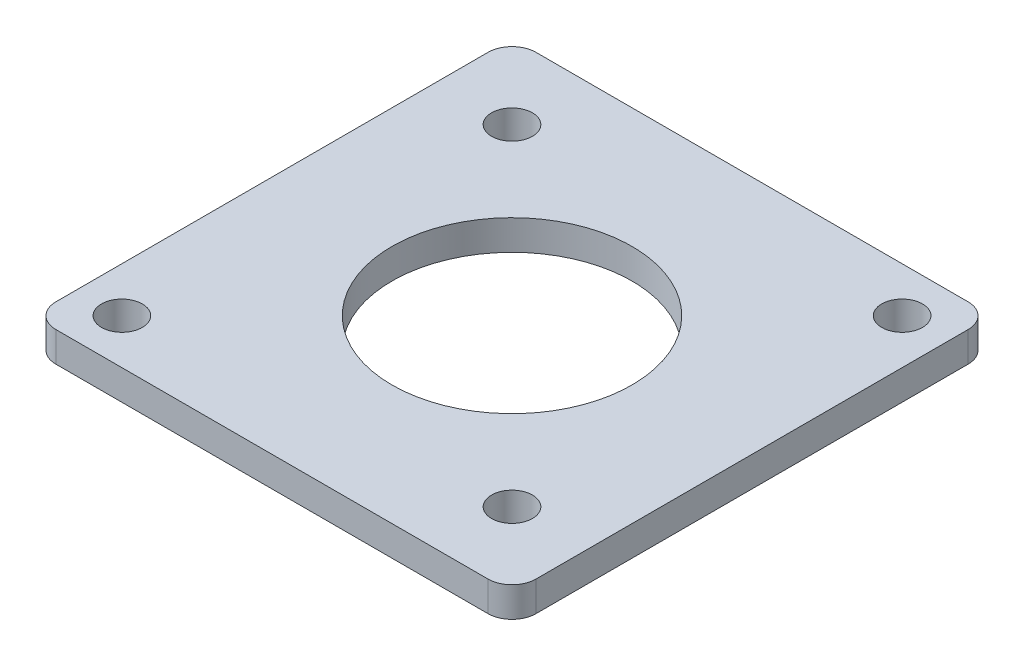
ISO-10303-21;
HEADER;
FILE_DESCRIPTION(('STEP AP214'),'2;1');
FILE_NAME('part.step','',(''),(''),'','','');
FILE_SCHEMA(('AUTOMOTIVE_DESIGN { 1 0 10303 214 1 1 1 1 }'));
ENDSEC;
DATA;
#1=APPLICATION_CONTEXT('core data for automotive mechanical design processes');
#2=APPLICATION_PROTOCOL_DEFINITION('international standard','automotive_design',2000,#1);
#3=PRODUCT_CONTEXT('',#1,'mechanical');
#4=PRODUCT('Part','Part','',(#3));
#5=PRODUCT_RELATED_PRODUCT_CATEGORY('part','',(#4));
#6=PRODUCT_DEFINITION_FORMATION('','',#4);
#7=PRODUCT_DEFINITION_CONTEXT('part definition',#1,'design');
#8=PRODUCT_DEFINITION('design','',#6,#7);
#9=PRODUCT_DEFINITION_SHAPE('','',#8);
#10=(LENGTH_UNIT() NAMED_UNIT(*) SI_UNIT(.MILLI.,.METRE.));
#11=(NAMED_UNIT(*) PLANE_ANGLE_UNIT() SI_UNIT($,.RADIAN.));
#12=(NAMED_UNIT(*) SI_UNIT($,.STERADIAN.) SOLID_ANGLE_UNIT());
#13=UNCERTAINTY_MEASURE_WITH_UNIT(LENGTH_MEASURE(1.E-05),#10,'distance_accuracy_value','');
#14=(GEOMETRIC_REPRESENTATION_CONTEXT(3) GLOBAL_UNCERTAINTY_ASSIGNED_CONTEXT((#13)) GLOBAL_UNIT_ASSIGNED_CONTEXT((#10,
#11,#12)) REPRESENTATION_CONTEXT('',''));
#15=CARTESIAN_POINT('',(0.,0.,0.));
#16=DIRECTION('',(0.,0.,1.));
#17=DIRECTION('',(1.,0.,0.));
#18=AXIS2_PLACEMENT_3D('',#15,#16,#17);
#19=CARTESIAN_POINT('',(0.,3.175,0.));
#20=DIRECTION('',(0.,1.,0.));
#21=DIRECTION('',(0.,0.,1.));
#22=AXIS2_PLACEMENT_3D('',#19,#20,#21);
#23=PLANE('',#22);
#24=CARTESIAN_POINT('',(46.0375,3.175,4.7625));
#25=DIRECTION('',(0.,1.,0.));
#26=DIRECTION('',(0.,0.,1.));
#27=AXIS2_PLACEMENT_3D('',#24,#25,#26);
#28=CIRCLE('',#27,2.159);
#29=CARTESIAN_POINT('',(46.0375,3.175,6.9215));
#30=VERTEX_POINT('',#29);
#31=EDGE_CURVE('E193',#30,#30,#28,.T.);
#32=ORIENTED_EDGE('',*,*,#31,.F.);
#33=EDGE_LOOP('',(#32));
#34=FACE_BOUND('',#33,.T.);
#35=CARTESIAN_POINT('',(7.88850056391519,3.175,7.88850056391511));
#36=DIRECTION('',(0.,1.,0.));
#37=DIRECTION('',(0.,0.,1.));
#38=AXIS2_PLACEMENT_3D('',#35,#36,#37);
#39=CIRCLE('',#38,2.159);
#40=CARTESIAN_POINT('',(7.88850056391519,3.175,10.0475005639151));
#41=VERTEX_POINT('',#40);
#42=EDGE_CURVE('E182',#41,#41,#39,.T.);
#43=ORIENTED_EDGE('',*,*,#42,.F.);
#44=EDGE_LOOP('',(#43));
#45=FACE_BOUND('',#44,.T.);
#46=DIRECTION('',(1.,0.,0.));
#47=VECTOR('',#46,1.);
#48=CARTESIAN_POINT('',(0.,3.175,50.8));
#49=LINE('',#48,#47);
#50=CARTESIAN_POINT('',(2.54,3.175,50.8));
#51=VERTEX_POINT('',#50);
#52=CARTESIAN_POINT('',(48.26,3.175,50.8));
#53=VERTEX_POINT('',#52);
#54=EDGE_CURVE('E167',#51,#53,#49,.T.);
#55=ORIENTED_EDGE('',*,*,#54,.T.);
#56=CARTESIAN_POINT('',(48.26,3.175,48.26));
#57=DIRECTION('',(0.,1.,0.));
#58=DIRECTION('',(0.,0.,1.));
#59=AXIS2_PLACEMENT_3D('',#56,#57,#58);
#60=CIRCLE('',#59,2.54);
#61=CARTESIAN_POINT('',(50.8,3.175,48.26));
#62=VERTEX_POINT('',#61);
#63=EDGE_CURVE('E147',#53,#62,#60,.T.);
#64=ORIENTED_EDGE('',*,*,#63,.T.);
#65=DIRECTION('',(0.,0.,-1.));
#66=VECTOR('',#65,1.);
#67=CARTESIAN_POINT('',(50.8,3.175,0.));
#68=LINE('',#67,#66);
#69=CARTESIAN_POINT('',(50.8,3.175,2.54));
#70=VERTEX_POINT('',#69);
#71=EDGE_CURVE('E117',#62,#70,#68,.T.);
#72=ORIENTED_EDGE('',*,*,#71,.T.);
#73=CARTESIAN_POINT('',(48.26,3.175,2.54));
#74=DIRECTION('',(0.,1.,0.));
#75=DIRECTION('',(0.,0.,1.));
#76=AXIS2_PLACEMENT_3D('',#73,#74,#75);
#77=CIRCLE('',#76,2.54);
#78=CARTESIAN_POINT('',(48.26,3.175,0.));
#79=VERTEX_POINT('',#78);
#80=EDGE_CURVE('E53',#70,#79,#77,.T.);
#81=ORIENTED_EDGE('',*,*,#80,.T.);
#82=DIRECTION('',(-1.,0.,0.));
#83=VECTOR('',#82,1.);
#84=CARTESIAN_POINT('',(0.,3.175,0.));
#85=LINE('',#84,#83);
#86=CARTESIAN_POINT('',(2.54,3.175,0.));
#87=VERTEX_POINT('',#86);
#88=EDGE_CURVE('E134',#79,#87,#85,.T.);
#89=ORIENTED_EDGE('',*,*,#88,.T.);
#90=CARTESIAN_POINT('',(2.54,3.175,2.54));
#91=DIRECTION('',(0.,1.,0.));
#92=DIRECTION('',(0.,0.,1.));
#93=AXIS2_PLACEMENT_3D('',#90,#91,#92);
#94=CIRCLE('',#93,2.54);
#95=CARTESIAN_POINT('',(0.,3.175,2.54));
#96=VERTEX_POINT('',#95);
#97=EDGE_CURVE('E142',#87,#96,#94,.T.);
#98=ORIENTED_EDGE('',*,*,#97,.T.);
#99=DIRECTION('',(0.,0.,1.));
#100=VECTOR('',#99,1.);
#101=CARTESIAN_POINT('',(0.,3.175,0.));
#102=LINE('',#101,#100);
#103=CARTESIAN_POINT('',(0.,3.175,48.26));
#104=VERTEX_POINT('',#103);
#105=EDGE_CURVE('E128',#96,#104,#102,.T.);
#106=ORIENTED_EDGE('',*,*,#105,.T.);
#107=CARTESIAN_POINT('',(2.54,3.175,48.26));
#108=DIRECTION('',(0.,1.,0.));
#109=DIRECTION('',(0.,0.,1.));
#110=AXIS2_PLACEMENT_3D('',#107,#108,#109);
#111=CIRCLE('',#110,2.54);
#112=EDGE_CURVE('E145',#104,#51,#111,.T.);
#113=ORIENTED_EDGE('',*,*,#112,.T.);
#114=EDGE_LOOP('',(#55,#64,#72,#81,#89,#98,#106,#113));
#115=FACE_BOUND('',#114,.T.);
#116=CARTESIAN_POINT('',(25.4,3.175,25.4));
#117=DIRECTION('',(0.,1.,0.));
#118=DIRECTION('',(0.,0.,1.));
#119=AXIS2_PLACEMENT_3D('',#116,#117,#118);
#120=CIRCLE('',#119,12.7);
#121=CARTESIAN_POINT('',(25.4,3.175,38.1));
#122=VERTEX_POINT('',#121);
#123=EDGE_CURVE('E173',#122,#122,#120,.T.);
#124=ORIENTED_EDGE('',*,*,#123,.F.);
#125=EDGE_LOOP('',(#124));
#126=FACE_BOUND('',#125,.T.);
#127=CARTESIAN_POINT('',(42.9114994360848,3.175,42.9114994360849));
#128=DIRECTION('',(0.,1.,0.));
#129=DIRECTION('',(0.,0.,1.));
#130=AXIS2_PLACEMENT_3D('',#127,#128,#129);
#131=CIRCLE('',#130,2.159);
#132=CARTESIAN_POINT('',(42.9114994360848,3.175,45.0704994360849));
#133=VERTEX_POINT('',#132);
#134=EDGE_CURVE('E187',#133,#133,#131,.T.);
#135=ORIENTED_EDGE('',*,*,#134,.F.);
#136=EDGE_LOOP('',(#135));
#137=FACE_BOUND('',#136,.T.);
#138=CARTESIAN_POINT('',(4.7625,3.175,46.0375));
#139=DIRECTION('',(0.,1.,0.));
#140=DIRECTION('',(0.,0.,1.));
#141=AXIS2_PLACEMENT_3D('',#138,#139,#140);
#142=CIRCLE('',#141,2.159);
#143=CARTESIAN_POINT('',(4.7625,3.175,48.1965));
#144=VERTEX_POINT('',#143);
#145=EDGE_CURVE('E199',#144,#144,#142,.T.);
#146=ORIENTED_EDGE('',*,*,#145,.F.);
#147=EDGE_LOOP('',(#146));
#148=FACE_BOUND('',#147,.T.);
#149=ADVANCED_FACE('F32',(#34,#45,#115,#126,#137,#148),#23,.T.);
#150=CARTESIAN_POINT('',(0.,0.,0.));
#151=DIRECTION('',(0.,1.,0.));
#152=DIRECTION('',(0.,0.,1.));
#153=AXIS2_PLACEMENT_3D('',#150,#151,#152);
#154=PLANE('',#153);
#155=DIRECTION('',(0.,0.,-1.));
#156=VECTOR('',#155,1.);
#157=CARTESIAN_POINT('',(50.8,0.,0.));
#158=LINE('',#157,#156);
#159=CARTESIAN_POINT('',(50.8,0.,48.26));
#160=VERTEX_POINT('',#159);
#161=CARTESIAN_POINT('',(50.8,0.,2.54));
#162=VERTEX_POINT('',#161);
#163=EDGE_CURVE('E115',#160,#162,#158,.T.);
#164=ORIENTED_EDGE('',*,*,#163,.F.);
#165=CARTESIAN_POINT('',(48.26,0.,48.26));
#166=DIRECTION('',(0.,1.,0.));
#167=DIRECTION('',(0.,0.,1.));
#168=AXIS2_PLACEMENT_3D('',#165,#166,#167);
#169=CIRCLE('',#168,2.54);
#170=CARTESIAN_POINT('',(48.26,0.,50.8));
#171=VERTEX_POINT('',#170);
#172=EDGE_CURVE('E98',#160,#171,#169,.F.);
#173=ORIENTED_EDGE('',*,*,#172,.T.);
#174=DIRECTION('',(1.,0.,0.));
#175=VECTOR('',#174,1.);
#176=CARTESIAN_POINT('',(0.,0.,50.8));
#177=LINE('',#176,#175);
#178=CARTESIAN_POINT('',(2.54,0.,50.8));
#179=VERTEX_POINT('',#178);
#180=EDGE_CURVE('E126',#179,#171,#177,.T.);
#181=ORIENTED_EDGE('',*,*,#180,.F.);
#182=CARTESIAN_POINT('',(2.54,0.,48.26));
#183=DIRECTION('',(0.,1.,0.));
#184=DIRECTION('',(0.,0.,1.));
#185=AXIS2_PLACEMENT_3D('',#182,#183,#184);
#186=CIRCLE('',#185,2.54);
#187=CARTESIAN_POINT('',(0.,0.,48.26));
#188=VERTEX_POINT('',#187);
#189=EDGE_CURVE('E109',#179,#188,#186,.F.);
#190=ORIENTED_EDGE('',*,*,#189,.T.);
#191=DIRECTION('',(0.,0.,1.));
#192=VECTOR('',#191,1.);
#193=CARTESIAN_POINT('',(0.,0.,0.));
#194=LINE('',#193,#192);
#195=CARTESIAN_POINT('',(0.,0.,2.54));
#196=VERTEX_POINT('',#195);
#197=EDGE_CURVE('E130',#196,#188,#194,.T.);
#198=ORIENTED_EDGE('',*,*,#197,.F.);
#199=CARTESIAN_POINT('',(2.54,0.,2.54));
#200=DIRECTION('',(0.,1.,0.));
#201=DIRECTION('',(0.,0.,1.));
#202=AXIS2_PLACEMENT_3D('',#199,#200,#201);
#203=CIRCLE('',#202,2.54);
#204=CARTESIAN_POINT('',(2.54,0.,0.));
#205=VERTEX_POINT('',#204);
#206=EDGE_CURVE('E118',#196,#205,#203,.F.);
#207=ORIENTED_EDGE('',*,*,#206,.T.);
#208=DIRECTION('',(-1.,0.,0.));
#209=VECTOR('',#208,1.);
#210=CARTESIAN_POINT('',(0.,0.,0.));
#211=LINE('',#210,#209);
#212=CARTESIAN_POINT('',(48.26,0.,0.));
#213=VERTEX_POINT('',#212);
#214=EDGE_CURVE('E125',#213,#205,#211,.T.);
#215=ORIENTED_EDGE('',*,*,#214,.F.);
#216=CARTESIAN_POINT('',(48.26,0.,2.54));
#217=DIRECTION('',(0.,1.,0.));
#218=DIRECTION('',(0.,0.,1.));
#219=AXIS2_PLACEMENT_3D('',#216,#217,#218);
#220=CIRCLE('',#219,2.54);
#221=EDGE_CURVE('E124',#213,#162,#220,.F.);
#222=ORIENTED_EDGE('',*,*,#221,.T.);
#223=EDGE_LOOP('',(#164,#173,#181,#190,#198,#207,#215,#222));
#224=FACE_BOUND('',#223,.T.);
#225=CARTESIAN_POINT('',(25.4,0.,25.4));
#226=DIRECTION('',(0.,1.,0.));
#227=DIRECTION('',(0.,0.,1.));
#228=AXIS2_PLACEMENT_3D('',#225,#226,#227);
#229=CIRCLE('',#228,12.7);
#230=CARTESIAN_POINT('',(25.4,0.,38.1));
#231=VERTEX_POINT('',#230);
#232=EDGE_CURVE('E175',#231,#231,#229,.T.);
#233=ORIENTED_EDGE('',*,*,#232,.T.);
#234=EDGE_LOOP('',(#233));
#235=FACE_BOUND('',#234,.T.);
#236=CARTESIAN_POINT('',(7.88850056391519,0.,7.88850056391511));
#237=DIRECTION('',(0.,1.,0.));
#238=DIRECTION('',(0.,0.,1.));
#239=AXIS2_PLACEMENT_3D('',#236,#237,#238);
#240=CIRCLE('',#239,2.159);
#241=CARTESIAN_POINT('',(7.88850056391519,0.,10.0475005639151));
#242=VERTEX_POINT('',#241);
#243=EDGE_CURVE('E184',#242,#242,#240,.T.);
#244=ORIENTED_EDGE('',*,*,#243,.T.);
#245=EDGE_LOOP('',(#244));
#246=FACE_BOUND('',#245,.T.);
#247=CARTESIAN_POINT('',(42.9114994360848,0.,42.9114994360849));
#248=DIRECTION('',(0.,1.,0.));
#249=DIRECTION('',(0.,0.,1.));
#250=AXIS2_PLACEMENT_3D('',#247,#248,#249);
#251=CIRCLE('',#250,2.159);
#252=CARTESIAN_POINT('',(42.9114994360848,0.,45.0704994360849));
#253=VERTEX_POINT('',#252);
#254=EDGE_CURVE('E190',#253,#253,#251,.T.);
#255=ORIENTED_EDGE('',*,*,#254,.T.);
#256=EDGE_LOOP('',(#255));
#257=FACE_BOUND('',#256,.T.);
#258=CARTESIAN_POINT('',(46.0375,0.,4.7625));
#259=DIRECTION('',(0.,1.,0.));
#260=DIRECTION('',(0.,0.,1.));
#261=AXIS2_PLACEMENT_3D('',#258,#259,#260);
#262=CIRCLE('',#261,2.159);
#263=CARTESIAN_POINT('',(46.0375,0.,6.9215));
#264=VERTEX_POINT('',#263);
#265=EDGE_CURVE('E196',#264,#264,#262,.T.);
#266=ORIENTED_EDGE('',*,*,#265,.T.);
#267=EDGE_LOOP('',(#266));
#268=FACE_BOUND('',#267,.T.);
#269=CARTESIAN_POINT('',(4.7625,0.,46.0375));
#270=DIRECTION('',(0.,1.,0.));
#271=DIRECTION('',(0.,0.,1.));
#272=AXIS2_PLACEMENT_3D('',#269,#270,#271);
#273=CIRCLE('',#272,2.159);
#274=CARTESIAN_POINT('',(4.7625,0.,48.1965));
#275=VERTEX_POINT('',#274);
#276=EDGE_CURVE('E202',#275,#275,#273,.T.);
#277=ORIENTED_EDGE('',*,*,#276,.T.);
#278=EDGE_LOOP('',(#277));
#279=FACE_BOUND('',#278,.T.);
#280=ADVANCED_FACE('F121',(#224,#235,#246,#257,#268,#279),#154,.F.);
#281=CARTESIAN_POINT('',(0.,3.175,0.));
#282=DIRECTION('',(1.,0.,0.));
#283=DIRECTION('',(0.,0.,-1.));
#284=AXIS2_PLACEMENT_3D('',#281,#282,#283);
#285=PLANE('',#284);
#286=ORIENTED_EDGE('',*,*,#197,.T.);
#287=DIRECTION('',(0.,-1.,0.));
#288=VECTOR('',#287,1.);
#289=CARTESIAN_POINT('',(0.,3.175,48.26));
#290=LINE('',#289,#288);
#291=EDGE_CURVE('E152',#188,#104,#290,.F.);
#292=ORIENTED_EDGE('',*,*,#291,.T.);
#293=ORIENTED_EDGE('',*,*,#105,.F.);
#294=DIRECTION('',(0.,-1.,0.));
#295=VECTOR('',#294,1.);
#296=CARTESIAN_POINT('',(0.,3.175,2.54));
#297=LINE('',#296,#295);
#298=EDGE_CURVE('E149',#96,#196,#297,.T.);
#299=ORIENTED_EDGE('',*,*,#298,.T.);
#300=EDGE_LOOP('',(#286,#292,#293,#299));
#301=FACE_BOUND('',#300,.T.);
#302=ADVANCED_FACE('F158',(#301),#285,.F.);
#303=CARTESIAN_POINT('',(0.,3.175,50.8));
#304=DIRECTION('',(0.,0.,-1.));
#305=DIRECTION('',(-1.,0.,0.));
#306=AXIS2_PLACEMENT_3D('',#303,#304,#305);
#307=PLANE('',#306);
#308=ORIENTED_EDGE('',*,*,#180,.T.);
#309=DIRECTION('',(0.,-1.,0.));
#310=VECTOR('',#309,1.);
#311=CARTESIAN_POINT('',(48.26,3.175,50.8));
#312=LINE('',#311,#310);
#313=EDGE_CURVE('E103',#171,#53,#312,.F.);
#314=ORIENTED_EDGE('',*,*,#313,.T.);
#315=ORIENTED_EDGE('',*,*,#54,.F.);
#316=DIRECTION('',(0.,-1.,0.));
#317=VECTOR('',#316,1.);
#318=CARTESIAN_POINT('',(2.54,3.175,50.8));
#319=LINE('',#318,#317);
#320=EDGE_CURVE('E108',#51,#179,#319,.T.);
#321=ORIENTED_EDGE('',*,*,#320,.T.);
#322=EDGE_LOOP('',(#308,#314,#315,#321));
#323=FACE_BOUND('',#322,.T.);
#324=ADVANCED_FACE('F172',(#323),#307,.F.);
#325=CARTESIAN_POINT('',(50.8,3.175,0.));
#326=DIRECTION('',(-1.,0.,0.));
#327=DIRECTION('',(0.,0.,1.));
#328=AXIS2_PLACEMENT_3D('',#325,#326,#327);
#329=PLANE('',#328);
#330=ORIENTED_EDGE('',*,*,#71,.F.);
#331=DIRECTION('',(0.,-1.,0.));
#332=VECTOR('',#331,1.);
#333=CARTESIAN_POINT('',(50.8,3.175,48.26));
#334=LINE('',#333,#332);
#335=EDGE_CURVE('E102',#62,#160,#334,.T.);
#336=ORIENTED_EDGE('',*,*,#335,.T.);
#337=ORIENTED_EDGE('',*,*,#163,.T.);
#338=DIRECTION('',(0.,-1.,0.));
#339=VECTOR('',#338,1.);
#340=CARTESIAN_POINT('',(50.8,3.175,2.54));
#341=LINE('',#340,#339);
#342=EDGE_CURVE('E119',#162,#70,#341,.F.);
#343=ORIENTED_EDGE('',*,*,#342,.T.);
#344=EDGE_LOOP('',(#330,#336,#337,#343));
#345=FACE_BOUND('',#344,.T.);
#346=ADVANCED_FACE('F114',(#345),#329,.F.);
#347=CARTESIAN_POINT('',(0.,3.175,0.));
#348=DIRECTION('',(0.,0.,1.));
#349=DIRECTION('',(1.,0.,0.));
#350=AXIS2_PLACEMENT_3D('',#347,#348,#349);
#351=PLANE('',#350);
#352=ORIENTED_EDGE('',*,*,#88,.F.);
#353=DIRECTION('',(0.,-1.,0.));
#354=VECTOR('',#353,1.);
#355=CARTESIAN_POINT('',(48.26,3.175,0.));
#356=LINE('',#355,#354);
#357=EDGE_CURVE('E11',#79,#213,#356,.T.);
#358=ORIENTED_EDGE('',*,*,#357,.T.);
#359=ORIENTED_EDGE('',*,*,#214,.T.);
#360=DIRECTION('',(0.,-1.,0.));
#361=VECTOR('',#360,1.);
#362=CARTESIAN_POINT('',(2.54,3.175,0.));
#363=LINE('',#362,#361);
#364=EDGE_CURVE('E40',#205,#87,#363,.F.);
#365=ORIENTED_EDGE('',*,*,#364,.T.);
#366=EDGE_LOOP('',(#352,#358,#359,#365));
#367=FACE_BOUND('',#366,.T.);
#368=ADVANCED_FACE('F224',(#367),#351,.F.);
#369=CARTESIAN_POINT('',(25.4,3.175,25.4));
#370=DIRECTION('',(0.,-1.,0.));
#371=DIRECTION('',(0.,0.,-1.));
#372=AXIS2_PLACEMENT_3D('',#369,#370,#371);
#373=CYLINDRICAL_SURFACE('',#372,12.7);
#374=ORIENTED_EDGE('',*,*,#123,.T.);
#375=EDGE_LOOP('',(#374));
#376=FACE_BOUND('',#375,.T.);
#377=ORIENTED_EDGE('',*,*,#232,.F.);
#378=EDGE_LOOP('',(#377));
#379=FACE_BOUND('',#378,.T.);
#380=ADVANCED_FACE('F221',(#376,#379),#373,.F.);
#381=CARTESIAN_POINT('',(7.88850056391519,3.175,7.88850056391511));
#382=DIRECTION('',(0.,-1.,0.));
#383=DIRECTION('',(0.,0.,-1.));
#384=AXIS2_PLACEMENT_3D('',#381,#382,#383);
#385=CYLINDRICAL_SURFACE('',#384,2.159);
#386=ORIENTED_EDGE('',*,*,#42,.T.);
#387=EDGE_LOOP('',(#386));
#388=FACE_BOUND('',#387,.T.);
#389=ORIENTED_EDGE('',*,*,#243,.F.);
#390=EDGE_LOOP('',(#389));
#391=FACE_BOUND('',#390,.T.);
#392=ADVANCED_FACE('F326',(#388,#391),#385,.F.);
#393=CARTESIAN_POINT('',(42.9114994360848,3.175,42.9114994360849));
#394=DIRECTION('',(0.,-1.,0.));
#395=DIRECTION('',(0.,0.,-1.));
#396=AXIS2_PLACEMENT_3D('',#393,#394,#395);
#397=CYLINDRICAL_SURFACE('',#396,2.159);
#398=ORIENTED_EDGE('',*,*,#134,.T.);
#399=EDGE_LOOP('',(#398));
#400=FACE_BOUND('',#399,.T.);
#401=ORIENTED_EDGE('',*,*,#254,.F.);
#402=EDGE_LOOP('',(#401));
#403=FACE_BOUND('',#402,.T.);
#404=ADVANCED_FACE('F316',(#400,#403),#397,.F.);
#405=CARTESIAN_POINT('',(46.0375,3.175,4.7625));
#406=DIRECTION('',(0.,-1.,0.));
#407=DIRECTION('',(0.,0.,-1.));
#408=AXIS2_PLACEMENT_3D('',#405,#406,#407);
#409=CYLINDRICAL_SURFACE('',#408,2.159);
#410=ORIENTED_EDGE('',*,*,#31,.T.);
#411=EDGE_LOOP('',(#410));
#412=FACE_BOUND('',#411,.T.);
#413=ORIENTED_EDGE('',*,*,#265,.F.);
#414=EDGE_LOOP('',(#413));
#415=FACE_BOUND('',#414,.T.);
#416=ADVANCED_FACE('F307',(#412,#415),#409,.F.);
#417=CARTESIAN_POINT('',(4.7625,3.175,46.0375));
#418=DIRECTION('',(0.,-1.,0.));
#419=DIRECTION('',(0.,0.,-1.));
#420=AXIS2_PLACEMENT_3D('',#417,#418,#419);
#421=CYLINDRICAL_SURFACE('',#420,2.159);
#422=ORIENTED_EDGE('',*,*,#145,.T.);
#423=EDGE_LOOP('',(#422));
#424=FACE_BOUND('',#423,.T.);
#425=ORIENTED_EDGE('',*,*,#276,.F.);
#426=EDGE_LOOP('',(#425));
#427=FACE_BOUND('',#426,.T.);
#428=ADVANCED_FACE('F208',(#424,#427),#421,.F.);
#429=CARTESIAN_POINT('',(48.26,3.175,48.26));
#430=DIRECTION('',(0.,-1.,0.));
#431=DIRECTION('',(0.,0.,-1.));
#432=AXIS2_PLACEMENT_3D('',#429,#430,#431);
#433=CYLINDRICAL_SURFACE('',#432,2.54);
#434=ORIENTED_EDGE('',*,*,#63,.F.);
#435=ORIENTED_EDGE('',*,*,#313,.F.);
#436=ORIENTED_EDGE('',*,*,#172,.F.);
#437=ORIENTED_EDGE('',*,*,#335,.F.);
#438=EDGE_LOOP('',(#434,#435,#436,#437));
#439=FACE_BOUND('',#438,.T.);
#440=ADVANCED_FACE('F101',(#439),#433,.T.);
#441=CARTESIAN_POINT('',(2.54,3.175,48.26));
#442=DIRECTION('',(0.,-1.,0.));
#443=DIRECTION('',(0.,0.,-1.));
#444=AXIS2_PLACEMENT_3D('',#441,#442,#443);
#445=CYLINDRICAL_SURFACE('',#444,2.54);
#446=ORIENTED_EDGE('',*,*,#112,.F.);
#447=ORIENTED_EDGE('',*,*,#291,.F.);
#448=ORIENTED_EDGE('',*,*,#189,.F.);
#449=ORIENTED_EDGE('',*,*,#320,.F.);
#450=EDGE_LOOP('',(#446,#447,#448,#449));
#451=FACE_BOUND('',#450,.T.);
#452=ADVANCED_FACE('F170',(#451),#445,.T.);
#453=CARTESIAN_POINT('',(48.26,3.175,2.54));
#454=DIRECTION('',(0.,-1.,0.));
#455=DIRECTION('',(0.,0.,-1.));
#456=AXIS2_PLACEMENT_3D('',#453,#454,#455);
#457=CYLINDRICAL_SURFACE('',#456,2.54);
#458=ORIENTED_EDGE('',*,*,#80,.F.);
#459=ORIENTED_EDGE('',*,*,#342,.F.);
#460=ORIENTED_EDGE('',*,*,#221,.F.);
#461=ORIENTED_EDGE('',*,*,#357,.F.);
#462=EDGE_LOOP('',(#458,#459,#460,#461));
#463=FACE_BOUND('',#462,.T.);
#464=ADVANCED_FACE('F236',(#463),#457,.T.);
#465=CARTESIAN_POINT('',(2.54,3.175,2.54));
#466=DIRECTION('',(0.,-1.,0.));
#467=DIRECTION('',(0.,0.,-1.));
#468=AXIS2_PLACEMENT_3D('',#465,#466,#467);
#469=CYLINDRICAL_SURFACE('',#468,2.54);
#470=ORIENTED_EDGE('',*,*,#97,.F.);
#471=ORIENTED_EDGE('',*,*,#364,.F.);
#472=ORIENTED_EDGE('',*,*,#206,.F.);
#473=ORIENTED_EDGE('',*,*,#298,.F.);
#474=EDGE_LOOP('',(#470,#471,#472,#473));
#475=FACE_BOUND('',#474,.T.);
#476=ADVANCED_FACE('F34',(#475),#469,.T.);
#477=CLOSED_SHELL('',(#149,#280,#302,#324,#346,#368,#380,#392,#404,#416,#428,#440,#452,#464,#476));
#478=MANIFOLD_SOLID_BREP('B2',#477);
#479=ADVANCED_BREP_SHAPE_REPRESENTATION('',(#18,#478),#14);
#480=SHAPE_DEFINITION_REPRESENTATION(#9,#479);
ENDSEC;
END-ISO-10303-21;
